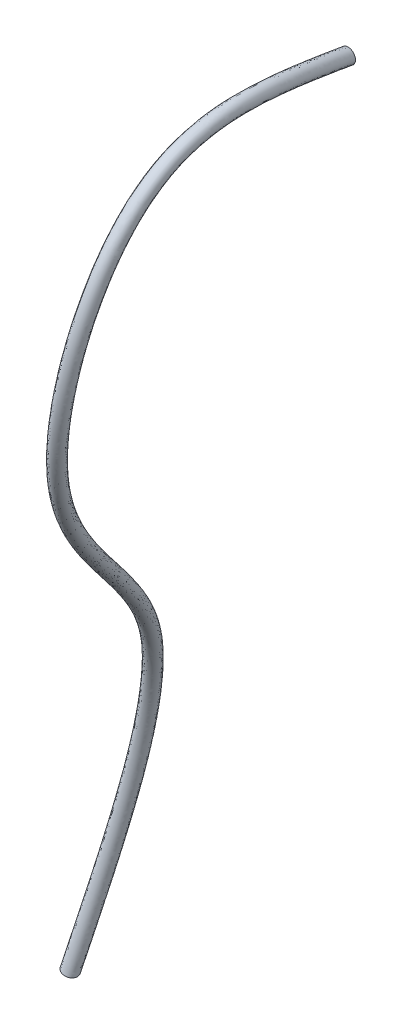
ISO-10303-21;
HEADER;
FILE_DESCRIPTION(('STEP AP214'),'2;1');
FILE_NAME('part.step','',(''),(''),'','','');
FILE_SCHEMA(('AUTOMOTIVE_DESIGN { 1 0 10303 214 1 1 1 1 }'));
ENDSEC;
DATA;
#1=APPLICATION_CONTEXT('core data for automotive mechanical design processes');
#2=APPLICATION_PROTOCOL_DEFINITION('international standard','automotive_design',2000,#1);
#3=PRODUCT_CONTEXT('',#1,'mechanical');
#4=PRODUCT('Part','Part','',(#3));
#5=PRODUCT_RELATED_PRODUCT_CATEGORY('part','',(#4));
#6=PRODUCT_DEFINITION_FORMATION('','',#4);
#7=PRODUCT_DEFINITION_CONTEXT('part definition',#1,'design');
#8=PRODUCT_DEFINITION('design','',#6,#7);
#9=PRODUCT_DEFINITION_SHAPE('','',#8);
#10=(LENGTH_UNIT() NAMED_UNIT(*) SI_UNIT(.MILLI.,.METRE.));
#11=(NAMED_UNIT(*) PLANE_ANGLE_UNIT() SI_UNIT($,.RADIAN.));
#12=(NAMED_UNIT(*) SI_UNIT($,.STERADIAN.) SOLID_ANGLE_UNIT());
#13=UNCERTAINTY_MEASURE_WITH_UNIT(LENGTH_MEASURE(1.E-05),#10,'distance_accuracy_value','');
#14=(GEOMETRIC_REPRESENTATION_CONTEXT(3) GLOBAL_UNCERTAINTY_ASSIGNED_CONTEXT((#13)) GLOBAL_UNIT_ASSIGNED_CONTEXT((#10,
#11,#12)) REPRESENTATION_CONTEXT('',''));
#15=CARTESIAN_POINT('',(0.,0.,0.));
#16=DIRECTION('',(0.,0.,1.));
#17=DIRECTION('',(1.,0.,0.));
#18=AXIS2_PLACEMENT_3D('',#15,#16,#17);
#19=CARTESIAN_POINT('',(-33.945147713459,-110.401100093467,4.85698409174221));
#20=DIRECTION('',(-0.282386861169322,-0.959298564270113,-0.00198121887679026));
#21=DIRECTION('',(0.947950522708219,-0.278728412664479,-0.153948947611713));
#22=AXIS2_PLACEMENT_3D('',#19,#20,#21);
#23=PLANE('',#22);
#24=CARTESIAN_POINT('',(-33.945147713459,-110.401100093467,4.85698409174221));
#25=DIRECTION('',(-0.282386861169322,-0.959298564270113,-0.00198121887679026));
#26=DIRECTION('',(0.947950522708219,-0.278728412664479,-0.153948947611713));
#27=AXIS2_PLACEMENT_3D('',#24,#25,#26);
#28=CIRCLE('',#27,0.609599999999999);
#29=CARTESIAN_POINT('',(-34.5291918596349,-110.229113330811,4.82656783311255));
#30=VERTEX_POINT('',#29);
#31=CARTESIAN_POINT('',(-34.4927669012922,-110.240340877083,5.07118460403073));
#32=VERTEX_POINT('',#31);
#33=EDGE_CURVE('E66',#30,#32,#28,.T.);
#34=ORIENTED_EDGE('',*,*,#33,.T.);
#35=DIRECTION('',(-0.147130782422143,0.0453512575662448,-0.988076817004128));
#36=VECTOR('',#35,1.);
#37=CARTESIAN_POINT('',(-34.4927669012922,-110.240340877083,5.07118460403073));
#38=LINE('',#37,#36);
#39=EDGE_CURVE('E65',#32,#30,#38,.T.);
#40=ORIENTED_EDGE('',*,*,#39,.T.);
#41=EDGE_LOOP('',(#34,#40));
#42=FACE_BOUND('',#41,.T.);
#43=ADVANCED_FACE('F32',(#42),#23,.T.);
#44=CARTESIAN_POINT('',(-16.0909,-39.1414,0.));
#45=DIRECTION('',(0.,0.,1.));
#46=DIRECTION('',(1.,0.,0.));
#47=AXIS2_PLACEMENT_3D('',#44,#45,#46);
#48=PLANE('',#47);
#49=CARTESIAN_POINT('',(-16.0909,-39.1414,0.));
#50=DIRECTION('',(0.,0.,1.));
#51=DIRECTION('',(1.,0.,0.));
#52=AXIS2_PLACEMENT_3D('',#49,#50,#51);
#53=CIRCLE('',#52,0.609599999999999);
#54=CARTESIAN_POINT('',(-16.6878,-39.2651842881791,0.));
#55=VERTEX_POINT('',#54);
#56=CARTESIAN_POINT('',(-16.6878,-39.0176157118209,0.));
#57=VERTEX_POINT('',#56);
#58=EDGE_CURVE('E46',#55,#57,#53,.T.);
#59=ORIENTED_EDGE('',*,*,#58,.F.);
#60=DIRECTION('',(0.,-1.,0.));
#61=VECTOR('',#60,1.);
#62=CARTESIAN_POINT('',(-16.6878,-39.0176157118209,0.));
#63=LINE('',#62,#61);
#64=EDGE_CURVE('E11',#57,#55,#63,.T.);
#65=ORIENTED_EDGE('',*,*,#64,.F.);
#66=EDGE_LOOP('',(#59,#65));
#67=FACE_BOUND('',#66,.T.);
#68=ADVANCED_FACE('F79',(#67),#48,.F.);
#69=CARTESIAN_POINT('',(-16.6878,-39.0176157118209,0.));
#70=CARTESIAN_POINT('',(-16.5432334960502,-38.5356056625516,2.15721072273632));
#71=CARTESIAN_POINT('',(-16.2709485325808,-37.6277598955769,6.22022689029826));
#72=CARTESIAN_POINT('',(-16.0636923749192,-37.3139877541494,11.0989482509274));
#73=CARTESIAN_POINT('',(-16.0897977851432,-38.1311917332078,14.1701498717585));
#74=CARTESIAN_POINT('',(-16.1633068542948,-38.9459790607914,15.7686483492374));
#75=CARTESIAN_POINT('',(-16.3212559480665,-40.316899897053,17.413351938478));
#76=CARTESIAN_POINT('',(-16.597063029434,-42.3835471124218,18.9587055948779));
#77=CARTESIAN_POINT('',(-17.0826185954515,-45.6417887063606,20.4771899051658));
#78=CARTESIAN_POINT('',(-17.7852105074095,-49.8421586548969,21.4840381481938));
#79=CARTESIAN_POINT('',(-18.7187566483895,-54.7095875324168,21.7156552117884));
#80=CARTESIAN_POINT('',(-19.8153762918317,-59.4050137179272,20.9470887839343));
#81=CARTESIAN_POINT('',(-21.433534822954,-64.9962894705166,18.6543600450163));
#82=CARTESIAN_POINT('',(-23.5881783791576,-70.9435127740857,14.2819441615031));
#83=CARTESIAN_POINT('',(-26.1557593715483,-77.1851674956069,8.54041104418136));
#84=CARTESIAN_POINT('',(-28.7094554250695,-84.0475590680425,3.72580597657721));
#85=CARTESIAN_POINT('',(-30.9463557399824,-92.4387054375659,2.26761173472089));
#86=CARTESIAN_POINT('',(-32.7872262923848,-101.207113000509,3.18264938525094));
#87=CARTESIAN_POINT('',(-33.9133823639333,-107.171687731686,4.42963546805344));
#88=CARTESIAN_POINT('',(-34.4927669012922,-110.240340877083,5.07118460403073));
#89=CARTESIAN_POINT('',(-16.6878,-39.100138570607,0.));
#90=CARTESIAN_POINT('',(-16.5432573912981,-38.6180934606423,2.15627569096023));
#91=CARTESIAN_POINT('',(-16.2710174335287,-37.7101816583146,6.21753076528107));
#92=CARTESIAN_POINT('',(-16.064251293356,-37.3955891747251,11.0776629774651));
#93=CARTESIAN_POINT('',(-16.0893004476793,-38.2009898327485,14.1248953536543));
#94=CARTESIAN_POINT('',(-16.1614176018146,-39.0033221988873,15.7083317188109));
#95=CARTESIAN_POINT('',(-16.3183172478376,-40.3580997366961,17.3410166268553));
#96=CARTESIAN_POINT('',(-16.59301537112,-42.4085822829798,18.8796010018821));
#97=CARTESIAN_POINT('',(-17.0783032333079,-45.6499077557562,20.3946048381327));
#98=CARTESIAN_POINT('',(-17.7816773026702,-49.835144448051,21.4014269606667));
#99=CARTESIAN_POINT('',(-18.7172991631449,-54.6873943082082,21.6355474405532));
#100=CARTESIAN_POINT('',(-19.8111307388406,-59.3656102125941,20.873945594552));
#101=CARTESIAN_POINT('',(-21.4227636475769,-64.9405993447348,18.5931996326952));
#102=CARTESIAN_POINT('',(-23.5789254367047,-70.8783745454397,14.2321311973401));
#103=CARTESIAN_POINT('',(-26.1432908539526,-77.1202567492156,8.49060680783603));
#104=CARTESIAN_POINT('',(-28.7088191149783,-83.9965344963049,3.65801443545997));
#105=CARTESIAN_POINT('',(-30.9547391944225,-92.4198991423296,2.18610896012876));
#106=CARTESIAN_POINT('',(-32.798806632896,-101.20084107435,3.10136122464378));
#107=CARTESIAN_POINT('',(-33.9253333348576,-107.167085957056,4.34818173043814));
#108=CARTESIAN_POINT('',(-34.5049085540731,-110.236598361659,4.98964568039134));
#109=CARTESIAN_POINT('',(-16.6878,-39.182661429393,0.));
#110=CARTESIAN_POINT('',(-16.543281286546,-38.7005812587331,2.15534065918413));
#111=CARTESIAN_POINT('',(-16.2710863344767,-37.7926034210522,6.21483464026387));
#112=CARTESIAN_POINT('',(-16.0648102117928,-37.4771905953007,11.0563777040027));
#113=CARTESIAN_POINT('',(-16.0888031102154,-38.2707879322892,14.0796408355501));
#114=CARTESIAN_POINT('',(-16.1595283493343,-39.0606653369833,15.6480150883845));
#115=CARTESIAN_POINT('',(-16.3153785476086,-40.3992995763391,17.2686813152326));
#116=CARTESIAN_POINT('',(-16.588967712806,-42.4336174535378,18.8004964088863));
#117=CARTESIAN_POINT('',(-17.0739878711643,-45.6580268051517,20.3120197710996));
#118=CARTESIAN_POINT('',(-17.7781440979309,-49.828130241205,21.3188157731396));
#119=CARTESIAN_POINT('',(-18.7158416779004,-54.6652010839995,21.555439669318));
#120=CARTESIAN_POINT('',(-19.8068851858496,-59.326206707261,20.8008024051696));
#121=CARTESIAN_POINT('',(-21.4119924721999,-64.8849092189529,18.5320392203741));
#122=CARTESIAN_POINT('',(-23.5696724942518,-70.8132363167937,14.182318233177));
#123=CARTESIAN_POINT('',(-26.1308223363569,-77.0553460028244,8.44080257149071));
#124=CARTESIAN_POINT('',(-28.708182804887,-83.9455099245673,3.59022289434272));
#125=CARTESIAN_POINT('',(-30.9631226488625,-92.4010928470932,2.10460618553665));
#126=CARTESIAN_POINT('',(-32.8103869734072,-101.194569148192,3.02007306403661));
#127=CARTESIAN_POINT('',(-33.937284305782,-107.162484182427,4.26672799282285));
#128=CARTESIAN_POINT('',(-34.517050206854,-110.232855846235,4.90810675675195));
#129=CARTESIAN_POINT('',(-16.6878,-39.2651842881791,0.));
#130=CARTESIAN_POINT('',(-16.543305181794,-38.7830690568239,2.15440562740804));
#131=CARTESIAN_POINT('',(-16.2711552354246,-37.8750251837899,6.21213851524667));
#132=CARTESIAN_POINT('',(-16.0653691302295,-37.5587920158764,11.0350924305404));
#133=CARTESIAN_POINT('',(-16.0883057727515,-38.3405860318298,14.0343863174459));
#134=CARTESIAN_POINT('',(-16.1576390968541,-39.1180084750792,15.587698457958));
#135=CARTESIAN_POINT('',(-16.3124398473796,-40.4404994159822,17.1963460036099));
#136=CARTESIAN_POINT('',(-16.584920054492,-42.4586526240959,18.7213918158906));
#137=CARTESIAN_POINT('',(-17.0696725090206,-45.6661458545472,20.2294347040665));
#138=CARTESIAN_POINT('',(-17.7746108931915,-49.8211160343591,21.2362045856125));
#139=CARTESIAN_POINT('',(-18.7143841926559,-54.6430078597909,21.4753318980828));
#140=CARTESIAN_POINT('',(-19.8026396328585,-59.2868032019279,20.7276592157873));
#141=CARTESIAN_POINT('',(-21.4012212968228,-64.829219093171,18.470878808053));
#142=CARTESIAN_POINT('',(-23.560419551799,-70.7480980881477,14.132505269014));
#143=CARTESIAN_POINT('',(-26.1183538187612,-76.9904352564331,8.39099833514538));
#144=CARTESIAN_POINT('',(-28.7075464947957,-83.8944853528297,3.52243135322548));
#145=CARTESIAN_POINT('',(-30.9715061033026,-92.3822865518569,2.02310341094454));
#146=CARTESIAN_POINT('',(-32.8219673139184,-101.188297222033,2.93878490342945));
#147=CARTESIAN_POINT('',(-33.9492352767064,-107.157882407798,4.18527425520755));
#148=CARTESIAN_POINT('',(-34.5291918596349,-110.229113330811,4.82656783311255));
#149=B_SPLINE_SURFACE_WITH_KNOTS('',3,3,((#69,#70,#71,#72,#73,#74,#75,#76,#77,#78,#79,#80,#81,
#82,#83,#84,#85,#86,#87,#88),(#89,#90,#91,#92,#93,#94,#95,#96,#97,#98,#99,#100,#101,#102,#103,
#104,#105,#106,#107,#108),(#109,#110,#111,#112,#113,#114,#115,#116,#117,#118,#119,#120,#121,
#122,#123,#124,#125,#126,#127,#128),(#129,#130,#131,#132,#133,#134,#135,#136,#137,#138,#139,
#140,#141,#142,#143,#144,#145,#146,#147,#148)),.UNSPECIFIED.,.F.,.F.,.F.,(4,4),(4,1,1,1,1,1,1,1,
1,1,1,1,1,1,1,1,1,4),(0.797269339247918,1.),(0.,0.0688264328418701,0.129631707484478,
0.147938695888342,0.165870588806959,0.184204369402629,0.213381834796753,0.244927934084081,
0.295578986772722,0.347529058955982,0.397406670223504,0.445106138437958,0.539578858047485,
0.633100196454668,0.721180324237206,0.807774572650488,0.901103902818393,1.),.UNSPECIFIED.);
#150=CARTESIAN_POINT('',(-16.6878,-39.2651842881791,0.));
#151=CARTESIAN_POINT('',(-16.543305181794,-38.7830690568239,2.15440562740804));
#152=CARTESIAN_POINT('',(-16.2711552354246,-37.8750251837899,6.21213851524667));
#153=CARTESIAN_POINT('',(-16.0653691302295,-37.5587920158764,11.0350924305404));
#154=CARTESIAN_POINT('',(-16.0883057727515,-38.3405860318298,14.0343863174459));
#155=CARTESIAN_POINT('',(-16.1576390968541,-39.1180084750792,15.587698457958));
#156=CARTESIAN_POINT('',(-16.3124398473796,-40.4404994159822,17.1963460036099));
#157=CARTESIAN_POINT('',(-16.584920054492,-42.4586526240959,18.7213918158906));
#158=CARTESIAN_POINT('',(-17.0696725090206,-45.6661458545472,20.2294347040665));
#159=CARTESIAN_POINT('',(-17.7746108931915,-49.8211160343591,21.2362045856125));
#160=CARTESIAN_POINT('',(-18.7143841926559,-54.6430078597909,21.4753318980828));
#161=CARTESIAN_POINT('',(-19.8026396328585,-59.2868032019279,20.7276592157873));
#162=CARTESIAN_POINT('',(-21.4012212968228,-64.829219093171,18.470878808053));
#163=CARTESIAN_POINT('',(-23.560419551799,-70.7480980881477,14.132505269014));
#164=CARTESIAN_POINT('',(-26.1183538187612,-76.9904352564331,8.39099833514538));
#165=CARTESIAN_POINT('',(-28.7075464947957,-83.8944853528297,3.52243135322548));
#166=CARTESIAN_POINT('',(-30.9715061033026,-92.3822865518569,2.02310341094454));
#167=CARTESIAN_POINT('',(-32.8219673139184,-101.188297222033,2.93878490342945));
#168=CARTESIAN_POINT('',(-33.9492352767064,-107.157882407798,4.18527425520755));
#169=CARTESIAN_POINT('',(-34.5291918596349,-110.229113330811,4.82656783311255));
#170=B_SPLINE_CURVE_WITH_KNOTS('',3,(#150,#151,#152,#153,#154,#155,#156,#157,#158,#159,#160,
#161,#162,#163,#164,#165,#166,#167,#168,#169),.UNSPECIFIED.,.F.,.F.,(4,1,1,1,1,1,1,1,1,1,1,1,1,
1,1,1,1,4),(0.,0.0688264328418701,0.129631707484478,0.147938695888342,0.165870588806959,
0.184204369402629,0.213381834796753,0.244927934084081,0.295578986772722,0.347529058955982,
0.397406670223504,0.445106138437958,0.539578858047485,0.633100196454668,0.721180324237206,
0.807774572650488,0.901103902818393,1.),.UNSPECIFIED.);
#171=EDGE_CURVE('E55',#55,#30,#170,.T.);
#172=CARTESIAN_POINT('',(-16.6878,-39.0176157118209,0.));
#173=CARTESIAN_POINT('',(-16.5432334960502,-38.5356056625516,2.15721072273632));
#174=CARTESIAN_POINT('',(-16.2709485325808,-37.6277598955769,6.22022689029826));
#175=CARTESIAN_POINT('',(-16.0636923749192,-37.3139877541494,11.0989482509274));
#176=CARTESIAN_POINT('',(-16.0897977851432,-38.1311917332078,14.1701498717585));
#177=CARTESIAN_POINT('',(-16.1633068542948,-38.9459790607914,15.7686483492374));
#178=CARTESIAN_POINT('',(-16.3212559480665,-40.316899897053,17.413351938478));
#179=CARTESIAN_POINT('',(-16.597063029434,-42.3835471124218,18.9587055948779));
#180=CARTESIAN_POINT('',(-17.0826185954515,-45.6417887063606,20.4771899051658));
#181=CARTESIAN_POINT('',(-17.7852105074095,-49.8421586548969,21.4840381481938));
#182=CARTESIAN_POINT('',(-18.7187566483895,-54.7095875324168,21.7156552117884));
#183=CARTESIAN_POINT('',(-19.8153762918317,-59.4050137179272,20.9470887839343));
#184=CARTESIAN_POINT('',(-21.433534822954,-64.9962894705166,18.6543600450163));
#185=CARTESIAN_POINT('',(-23.5881783791576,-70.9435127740857,14.2819441615031));
#186=CARTESIAN_POINT('',(-26.1557593715483,-77.1851674956069,8.54041104418136));
#187=CARTESIAN_POINT('',(-28.7094554250695,-84.0475590680425,3.72580597657721));
#188=CARTESIAN_POINT('',(-30.9463557399824,-92.4387054375659,2.26761173472089));
#189=CARTESIAN_POINT('',(-32.7872262923848,-101.207113000509,3.18264938525094));
#190=CARTESIAN_POINT('',(-33.9133823639333,-107.171687731686,4.42963546805344));
#191=CARTESIAN_POINT('',(-34.4927669012922,-110.240340877083,5.07118460403073));
#192=B_SPLINE_CURVE_WITH_KNOTS('',3,(#172,#173,#174,#175,#176,#177,#178,#179,#180,#181,#182,
#183,#184,#185,#186,#187,#188,#189,#190,#191),.UNSPECIFIED.,.F.,.F.,(4,1,1,1,1,1,1,1,1,1,1,1,1,
1,1,1,1,4),(0.,0.0688264328418701,0.129631707484478,0.147938695888342,0.165870588806959,
0.184204369402629,0.213381834796753,0.244927934084081,0.295578986772722,0.347529058955982,
0.397406670223504,0.445106138437958,0.539578858047485,0.633100196454668,0.721180324237206,
0.807774572650488,0.901103902818393,1.),.UNSPECIFIED.);
#193=EDGE_CURVE('E38',#57,#32,#192,.T.);
#194=ORIENTED_EDGE('',*,*,#64,.T.);
#195=ORIENTED_EDGE('',*,*,#171,.T.);
#196=ORIENTED_EDGE('',*,*,#39,.F.);
#197=ORIENTED_EDGE('',*,*,#193,.F.);
#198=EDGE_LOOP('',(#194,#195,#196,#197));
#199=FACE_BOUND('',#198,.T.);
#200=ADVANCED_FACE('F34',(#199),#149,.T.);
#201=CARTESIAN_POINT('',(-16.6878,-39.2651842881791,0.));
#202=CARTESIAN_POINT('',(-16.543305181794,-38.7830690568239,2.15440562740804));
#203=CARTESIAN_POINT('',(-16.2711552354246,-37.8750251837899,6.21213851524667));
#204=CARTESIAN_POINT('',(-16.0653691302295,-37.5587920158764,11.0350924305404));
#205=CARTESIAN_POINT('',(-16.0883057727515,-38.3405860318298,14.0343863174459));
#206=CARTESIAN_POINT('',(-16.1576390968541,-39.1180084750792,15.587698457958));
#207=CARTESIAN_POINT('',(-16.3124398473796,-40.4404994159822,17.1963460036099));
#208=CARTESIAN_POINT('',(-16.584920054492,-42.4586526240959,18.7213918158906));
#209=CARTESIAN_POINT('',(-17.0696725090206,-45.6661458545472,20.2294347040665));
#210=CARTESIAN_POINT('',(-17.7746108931915,-49.8211160343591,21.2362045856125));
#211=CARTESIAN_POINT('',(-18.7143841926559,-54.6430078597909,21.4753318980828));
#212=CARTESIAN_POINT('',(-19.8026396328585,-59.2868032019279,20.7276592157873));
#213=CARTESIAN_POINT('',(-21.4012212968228,-64.829219093171,18.470878808053));
#214=CARTESIAN_POINT('',(-23.560419551799,-70.7480980881477,14.132505269014));
#215=CARTESIAN_POINT('',(-26.1183538187612,-76.9904352564331,8.39099833514538));
#216=CARTESIAN_POINT('',(-28.7075464947957,-83.8944853528297,3.52243135322548));
#217=CARTESIAN_POINT('',(-30.9715061033026,-92.3822865518569,2.02310341094454));
#218=CARTESIAN_POINT('',(-32.8219673139184,-101.188297222033,2.93878490342945));
#219=CARTESIAN_POINT('',(-33.9492352767064,-107.157882407798,4.18527425520755));
#220=CARTESIAN_POINT('',(-34.5291918596349,-110.229113330811,4.82656783311255));
#221=CARTESIAN_POINT('',(-16.483273097855,-40.2514331060723,0.));
#222=CARTESIAN_POINT('',(-16.3390660775982,-39.7689846052397,2.14358521997421));
#223=CARTESIAN_POINT('',(-16.0674581866288,-38.8603130330845,6.18093832299169));
#224=CARTESIAN_POINT('',(-15.8675782164802,-38.5361192407454,10.7887689706608));
#225=CARTESIAN_POINT('',(-15.8786183283416,-39.1832419661864,13.5097871907729));
#226=CARTESIAN_POINT('',(-15.9320806011303,-39.8178830149174,14.8878241057106));
#227=CARTESIAN_POINT('',(-16.0753639263076,-40.9567266853546,16.3543896453887));
#228=CARTESIAN_POINT('',(-16.3356448860222,-42.7903362304867,17.7970516773714));
#229=CARTESIAN_POINT('',(-16.8183517320478,-45.805030760538,19.2575529715459));
#230=CARTESIAN_POINT('',(-17.5338210989756,-49.7870051489077,20.2536427751037));
#231=CARTESIAN_POINT('',(-18.5001280405554,-54.432861768963,20.5068645552694));
#232=CARTESIAN_POINT('',(-19.5572779371915,-58.8755056601075,19.8332806199151));
#233=CARTESIAN_POINT('',(-21.0802580012471,-64.2292408929847,17.7150019094627));
#234=CARTESIAN_POINT('',(-23.2583471226026,-70.0288166039115,13.4956733816181));
#235=CARTESIAN_POINT('',(-25.7783957409151,-76.2786227661565,7.75997074521548));
#236=CARTESIAN_POINT('',(-28.5082565852812,-83.3428291911547,2.67067076636216));
#237=CARTESIAN_POINT('',(-30.8786016769131,-92.2163426121021,1.01590480862585));
#238=CARTESIAN_POINT('',(-32.7666064951806,-101.170442550389,1.93527170090461));
#239=CARTESIAN_POINT('',(-33.8982238030253,-107.15992533168,3.18013469121149));
#240=CARTESIAN_POINT('',(-34.4804180360782,-110.241393165429,3.82059153901096));
#241=CARTESIAN_POINT('',(-15.4813,-40.1486328352953,0.));
#242=CARTESIAN_POINT('',(-15.3370740916145,-39.6666480908386,2.14648602253257));
#243=CARTESIAN_POINT('',(-15.0654306256445,-38.7588499844201,6.18930266583811));
#244=CARTESIAN_POINT('',(-14.8651843396811,-38.4447092049154,10.8547776566928));
#245=CARTESIAN_POINT('',(-14.8811018842843,-39.1378537086842,13.6457580686601));
#246=CARTESIAN_POINT('',(-14.9400410633282,-39.8177498144212,15.065756709399));
#247=CARTESIAN_POINT('',(-15.0896519603628,-41.0221897174904,16.5549164373329));
#248=CARTESIAN_POINT('',(-15.3564786504435,-42.9182819329543,17.9987478079986));
#249=CARTESIAN_POINT('',(-15.8451713187514,-45.9999505748663,19.4344570097972));
#250=CARTESIAN_POINT('',(-16.565463044037,-50.039307605094,20.3797871922413));
#251=CARTESIAN_POINT('',(-17.5376411467574,-54.7303931038129,20.5523669575394));
#252=CARTESIAN_POINT('',(-18.6091167376616,-59.21668030057,19.8252985909129));
#253=CARTESIAN_POINT('',(-20.1519224359328,-64.6199231689531,17.6690327031334));
#254=CARTESIAN_POINT('',(-22.3317755470749,-70.3999791160387,13.3543882654296));
#255=CARTESIAN_POINT('',(-24.8584968545247,-76.6727735390134,7.64659888775382));
#256=CARTESIAN_POINT('',(-27.5699872500068,-83.691265675848,2.55147436236403));
#257=CARTESIAN_POINT('',(-29.9221803397662,-92.5278996572239,0.955077091960323));
#258=CARTESIAN_POINT('',(-31.8029543207453,-101.457999562699,1.87966594651655));
#259=CARTESIAN_POINT('',(-32.9337173209271,-107.44509438234,3.12646201958696));
#260=CARTESIAN_POINT('',(-33.5154720299543,-110.525333658084,3.76791339939751));
#261=CARTESIAN_POINT('',(-15.4813,-38.1341671647047,0.));
#262=CARTESIAN_POINT('',(-15.3364907846696,-37.6530382869506,2.16931108508565));
#263=CARTESIAN_POINT('',(-15.0637486844667,-36.7468521696684,6.25511777901597));
#264=CARTESIAN_POINT('',(-14.8515405806051,-36.4527367643186,11.3743725096804));
#265=CARTESIAN_POINT('',(-14.8932423901082,-37.4340121614387,14.7504662004563));
#266=CARTESIAN_POINT('',(-14.9861596093955,-38.4179463558699,16.5381460951673));
#267=CARTESIAN_POINT('',(-15.16138857752,-40.0164603497036,18.3206938737787));
#268=CARTESIAN_POINT('',(-15.4552860456282,-42.3071483344772,19.9297701855586));
#269=CARTESIAN_POINT('',(-15.9505136326559,-45.8017564438617,21.4504412460306));
#270=CARTESIAN_POINT('',(-16.6517121119834,-50.2105314224146,22.3964090559068));
#271=CARTESIAN_POINT('',(-17.5732198219714,-55.2721519442806,22.507877921105));
#272=CARTESIAN_POINT('',(-18.7127549402033,-60.1785593479293,21.6107971329626));
#273=CARTESIAN_POINT('',(-20.4148576195679,-65.9793749406043,19.1620196504161));
#274=CARTESIAN_POINT('',(-22.5576491437661,-71.9900685455711,14.5703726330696));
#275=CARTESIAN_POINT('',(-25.1628658624483,-78.2573098987706,8.86237020061821));
#276=CARTESIAN_POINT('',(-27.5855202169154,-84.9368265984092,4.20633380792903));
#277=CARTESIAN_POINT('',(-29.7175318166918,-92.9869801677864,2.94464148525619));
#278=CARTESIAN_POINT('',(-31.5202666054057,-101.611103564674,3.86399139739734));
#279=CARTESIAN_POINT('',(-32.6419821458313,-107.557428312001,5.11482937114375));
#280=CARTESIAN_POINT('',(-33.2190821196778,-110.61669220957,5.7583602271587));
#281=CARTESIAN_POINT('',(-16.483273097855,-38.0313668939276,0.));
#282=CARTESIAN_POINT('',(-16.3384232371376,-37.5498616113271,2.16873985571905));
#283=CARTESIAN_POINT('',(-16.0656045830483,-36.6429665512604,6.25347066302994));
#284=CARTESIAN_POINT('',(-15.8525419470746,-36.3408419642674,11.3613947512648));
#285=CARTESIAN_POINT('',(-15.8919979193525,-37.3055028192198,14.727244124136));
#286=CARTESIAN_POINT('',(-15.9829061015952,-38.2752127141314,16.5104886038881));
#287=CARTESIAN_POINT('',(-16.1544221312943,-39.8483504938008,18.3003859867767));
#288=CARTESIAN_POINT('',(-16.4445367687493,-42.1168290703038,19.925158201053));
#289=CARTESIAN_POINT('',(-16.9344455008435,-45.5866085257428,21.4792927372904));
#290=CARTESIAN_POINT('',(-17.6288729255577,-49.9757044239053,22.4760852458576));
#291=CARTESIAN_POINT('',(-18.5393379491027,-55.0299136395469,22.6619590207996));
#292=CARTESIAN_POINT('',(-19.6714936694868,-59.9355560766461,21.8010108438192));
#293=CARTESIAN_POINT('',(-21.3700288946876,-65.7274411300721,19.3603661989736));
#294=CARTESIAN_POINT('',(-23.5072738467213,-71.7811938562668,14.835763634088));
#295=CARTESIAN_POINT('',(-26.1138292806275,-78.0248801909259,9.09982619809784));
#296=CARTESIAN_POINT('',(-28.5253748789864,-84.715514643042,4.49442859682959));
#297=CARTESIAN_POINT('',(-30.6530663014159,-92.7222778310702,3.2085282675044));
#298=CARTESIAN_POINT('',(-32.4550670857105,-101.339172664132,4.12212152004688));
#299=CARTESIAN_POINT('',(-33.5767135313042,-107.283724295028,5.37143893579007));
#300=CARTESIAN_POINT('',(-34.1537779572563,-110.34207596003,6.01418749544531));
#301=CARTESIAN_POINT('',(-16.6878,-39.0176157118209,0.));
#302=CARTESIAN_POINT('',(-16.5432334960502,-38.5356056625516,2.15721072273632));
#303=CARTESIAN_POINT('',(-16.2709485325808,-37.6277598955769,6.22022689029826));
#304=CARTESIAN_POINT('',(-16.0636923749192,-37.3139877541494,11.0989482509274));
#305=CARTESIAN_POINT('',(-16.0897977851432,-38.1311917332078,14.1701498717585));
#306=CARTESIAN_POINT('',(-16.1633068542948,-38.9459790607914,15.7686483492374));
#307=CARTESIAN_POINT('',(-16.3212559480665,-40.316899897053,17.413351938478));
#308=CARTESIAN_POINT('',(-16.597063029434,-42.3835471124218,18.9587055948779));
#309=CARTESIAN_POINT('',(-17.0826185954515,-45.6417887063606,20.4771899051658));
#310=CARTESIAN_POINT('',(-17.7852105074095,-49.8421586548969,21.4840381481938));
#311=CARTESIAN_POINT('',(-18.7187566483895,-54.7095875324168,21.7156552117884));
#312=CARTESIAN_POINT('',(-19.8153762918317,-59.4050137179272,20.9470887839343));
#313=CARTESIAN_POINT('',(-21.433534822954,-64.9962894705166,18.6543600450163));
#314=CARTESIAN_POINT('',(-23.5881783791576,-70.9435127740857,14.2819441615031));
#315=CARTESIAN_POINT('',(-26.1557593715483,-77.1851674956069,8.54041104418136));
#316=CARTESIAN_POINT('',(-28.7094554250695,-84.0475590680425,3.72580597657721));
#317=CARTESIAN_POINT('',(-30.9463557399824,-92.4387054375659,2.26761173472089));
#318=CARTESIAN_POINT('',(-32.7872262923848,-101.207113000509,3.18264938525094));
#319=CARTESIAN_POINT('',(-33.9133823639333,-107.171687731686,4.42963546805344));
#320=CARTESIAN_POINT('',(-34.4927669012922,-110.240340877083,5.07118460403073));
#321=(BOUNDED_SURFACE() B_SPLINE_SURFACE(3,3,((#201,#202,#203,#204,#205,#206,#207,#208,#209,
#210,#211,#212,#213,#214,#215,#216,#217,#218,#219,#220),(#221,#222,#223,#224,#225,#226,#227,
#228,#229,#230,#231,#232,#233,#234,#235,#236,#237,#238,#239,#240),(#241,#242,#243,#244,#245,
#246,#247,#248,#249,#250,#251,#252,#253,#254,#255,#256,#257,#258,#259,#260),(#261,#262,#263,
#264,#265,#266,#267,#268,#269,#270,#271,#272,#273,#274,#275,#276,#277,#278,#279,#280),(#281,
#282,#283,#284,#285,#286,#287,#288,#289,#290,#291,#292,#293,#294,#295,#296,#297,#298,#299,#300),
(#301,#302,#303,#304,#305,#306,#307,#308,#309,#310,#311,#312,#313,#314,#315,#316,#317,#318,#319,
#320)),.UNSPECIFIED.,.F.,.F.,.F.) B_SPLINE_SURFACE_WITH_KNOTS((4,2,4),(4,1,1,1,1,1,1,1,1,1,1,1,
1,1,1,1,1,4),(0.,0.398634669623959,0.797269339247918),(0.,0.0688264328418701,0.129631707484478,
0.147938695888342,0.165870588806959,0.184204369402629,0.213381834796753,0.244927934084081,
0.295578986772722,0.347529058955982,0.397406670223504,0.445106138437958,0.539578858047485,
0.633100196454668,0.721180324237206,0.807774572650488,0.901103902818393,1.),
.UNSPECIFIED.) GEOMETRIC_REPRESENTATION_ITEM() RATIONAL_B_SPLINE_SURFACE(((1.,1.,1.,1.,1.,1.,1.,
1.,1.,1.,1.,1.,1.,1.,1.,1.,1.,1.,1.,1.),(0.161101661903389,0.161101661903389,0.161101661903389,
0.161101661903389,0.161101661903389,0.161101661903389,0.161101661903389,0.161101661903389,
0.161101661903389,0.161101661903389,0.161101661903389,0.161101661903389,0.161101661903389,
0.161101661903389,0.161101661903389,0.161101661903389,0.161101661903389,0.161101661903389,
0.161101661903389,0.161101661903389),(0.0646621336449531,0.0646621336449531,0.0646621336449531,
0.0646621336449531,0.0646621336449531,0.0646621336449531,0.0646621336449531,0.0646621336449531,
0.0646621336449531,0.0646621336449531,0.0646621336449531,0.0646621336449531,0.0646621336449531,
0.0646621336449531,0.0646621336449531,0.0646621336449531,0.0646621336449531,0.0646621336449531,
0.0646621336449531,0.0646621336449531),(0.0646621336449531,0.0646621336449531,
0.0646621336449531,0.0646621336449531,0.0646621336449531,0.0646621336449531,0.0646621336449531,
0.0646621336449531,0.0646621336449531,0.0646621336449531,0.0646621336449531,0.0646621336449531,
0.0646621336449531,0.0646621336449531,0.0646621336449531,0.0646621336449531,0.0646621336449531,
0.0646621336449531,0.0646621336449531,0.0646621336449531),(0.161101661903389,0.161101661903389,
0.161101661903389,0.161101661903389,0.161101661903389,0.161101661903389,0.161101661903389,
0.161101661903389,0.161101661903389,0.161101661903389,0.161101661903389,0.161101661903389,
0.161101661903389,0.161101661903389,0.161101661903389,0.161101661903389,0.161101661903389,
0.161101661903389,0.161101661903389,0.161101661903389),(1.,1.,1.,1.,1.,1.,1.,1.,1.,1.,1.,1.,1.,
1.,1.,1.,1.,1.,1.,1.))) REPRESENTATION_ITEM('') SURFACE());
#322=ORIENTED_EDGE('',*,*,#58,.T.);
#323=ORIENTED_EDGE('',*,*,#193,.T.);
#324=ORIENTED_EDGE('',*,*,#33,.F.);
#325=ORIENTED_EDGE('',*,*,#171,.F.);
#326=EDGE_LOOP('',(#322,#323,#324,#325));
#327=FACE_BOUND('',#326,.T.);
#328=ADVANCED_FACE('F69',(#327),#321,.T.);
#329=CLOSED_SHELL('',(#43,#68,#200,#328));
#330=MANIFOLD_SOLID_BREP('B2',#329);
#331=ADVANCED_BREP_SHAPE_REPRESENTATION('',(#18,#330),#14);
#332=SHAPE_DEFINITION_REPRESENTATION(#9,#331);
ENDSEC;
END-ISO-10303-21;
